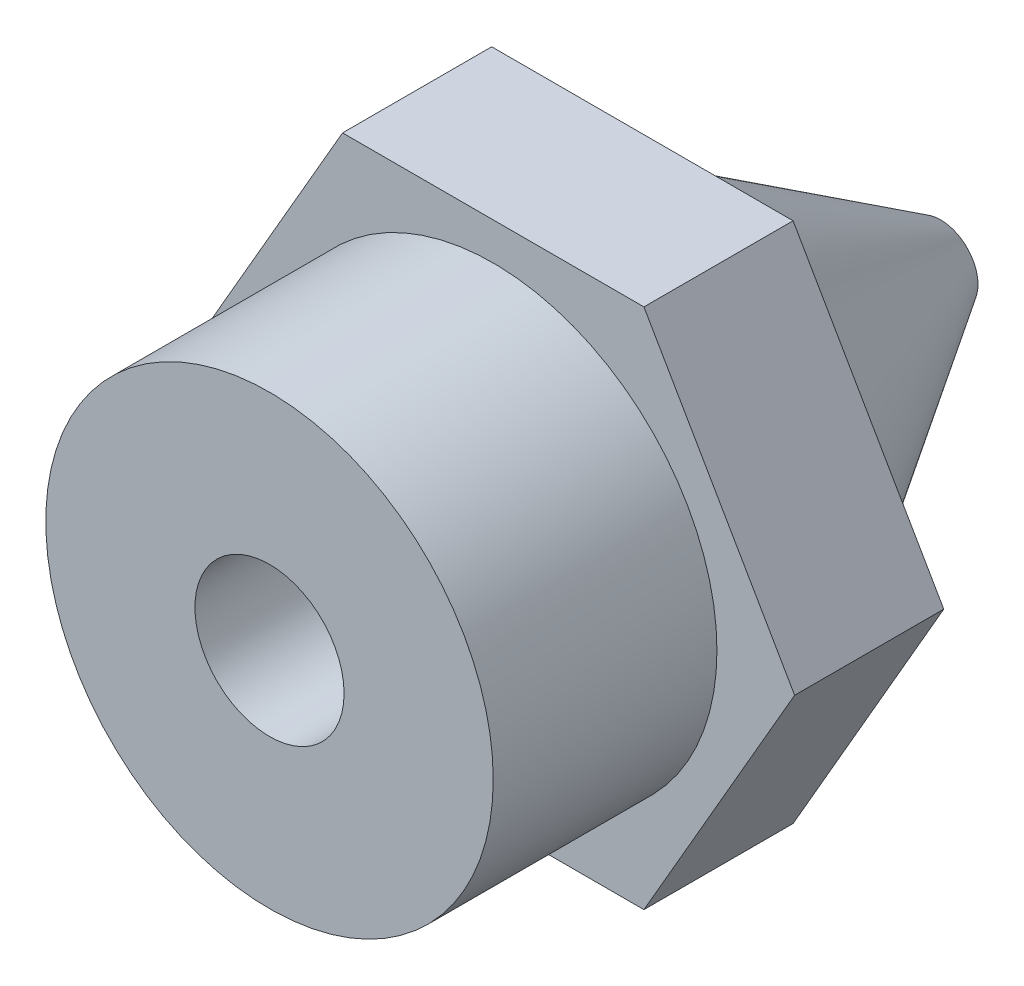
ISO-10303-21;
HEADER;
FILE_DESCRIPTION(('STEP AP214'),'2;1');
FILE_NAME('part.step','',(''),(''),'','','');
FILE_SCHEMA(('AUTOMOTIVE_DESIGN { 1 0 10303 214 1 1 1 1 }'));
ENDSEC;
DATA;
#1=APPLICATION_CONTEXT('core data for automotive mechanical design processes');
#2=APPLICATION_PROTOCOL_DEFINITION('international standard','automotive_design',2000,#1);
#3=PRODUCT_CONTEXT('',#1,'mechanical');
#4=PRODUCT('Part','Part','',(#3));
#5=PRODUCT_RELATED_PRODUCT_CATEGORY('part','',(#4));
#6=PRODUCT_DEFINITION_FORMATION('','',#4);
#7=PRODUCT_DEFINITION_CONTEXT('part definition',#1,'design');
#8=PRODUCT_DEFINITION('design','',#6,#7);
#9=PRODUCT_DEFINITION_SHAPE('','',#8);
#10=(LENGTH_UNIT() NAMED_UNIT(*) SI_UNIT(.MILLI.,.METRE.));
#11=(NAMED_UNIT(*) PLANE_ANGLE_UNIT() SI_UNIT($,.RADIAN.));
#12=(NAMED_UNIT(*) SI_UNIT($,.STERADIAN.) SOLID_ANGLE_UNIT());
#13=UNCERTAINTY_MEASURE_WITH_UNIT(LENGTH_MEASURE(1.E-05),#10,'distance_accuracy_value','');
#14=(GEOMETRIC_REPRESENTATION_CONTEXT(3) GLOBAL_UNCERTAINTY_ASSIGNED_CONTEXT((#13)) GLOBAL_UNIT_ASSIGNED_CONTEXT((#10,
#11,#12)) REPRESENTATION_CONTEXT('',''));
#15=CARTESIAN_POINT('',(0.,0.,0.));
#16=DIRECTION('',(0.,0.,1.));
#17=DIRECTION('',(1.,0.,0.));
#18=AXIS2_PLACEMENT_3D('',#15,#16,#17);
#19=CARTESIAN_POINT('',(2.02072594216368,3.50000000000001,9.));
#20=DIRECTION('',(0.,-1.,0.));
#21=DIRECTION('',(1.,0.,0.));
#22=AXIS2_PLACEMENT_3D('',#19,#20,#21);
#23=PLANE('',#22);
#24=DIRECTION('',(1.,0.,0.));
#25=VECTOR('',#24,1.);
#26=CARTESIAN_POINT('',(2.02072594216368,3.50000000000001,4.));
#27=LINE('',#26,#25);
#28=CARTESIAN_POINT('',(-2.02072594216371,3.49999999999999,4.));
#29=VERTEX_POINT('',#28);
#30=CARTESIAN_POINT('',(2.02072594216368,3.50000000000001,4.));
#31=VERTEX_POINT('',#30);
#32=EDGE_CURVE('E61',#29,#31,#27,.T.);
#33=ORIENTED_EDGE('',*,*,#32,.F.);
#34=DIRECTION('',(0.,0.,-1.));
#35=VECTOR('',#34,1.);
#36=CARTESIAN_POINT('',(-2.02072594216371,3.49999999999999,9.));
#37=LINE('',#36,#35);
#38=CARTESIAN_POINT('',(-2.02072594216371,3.49999999999999,6.));
#39=VERTEX_POINT('',#38);
#40=EDGE_CURVE('E129',#39,#29,#37,.T.);
#41=ORIENTED_EDGE('',*,*,#40,.F.);
#42=DIRECTION('',(-1.,0.,0.));
#43=VECTOR('',#42,1.);
#44=CARTESIAN_POINT('',(2.02072594216368,3.50000000000001,6.));
#45=LINE('',#44,#43);
#46=CARTESIAN_POINT('',(2.02072594216368,3.50000000000001,6.));
#47=VERTEX_POINT('',#46);
#48=EDGE_CURVE('E120',#47,#39,#45,.T.);
#49=ORIENTED_EDGE('',*,*,#48,.F.);
#50=DIRECTION('',(0.,0.,-1.));
#51=VECTOR('',#50,1.);
#52=CARTESIAN_POINT('',(2.02072594216368,3.50000000000001,9.));
#53=LINE('',#52,#51);
#54=EDGE_CURVE('E116',#47,#31,#53,.T.);
#55=ORIENTED_EDGE('',*,*,#54,.T.);
#56=EDGE_LOOP('',(#33,#41,#49,#55));
#57=FACE_BOUND('',#56,.T.);
#58=ADVANCED_FACE('F46',(#57),#23,.F.);
#59=CARTESIAN_POINT('',(-2.02072594216371,3.49999999999999,9.));
#60=DIRECTION('',(0.866025403784441,-0.499999999999995,0.));
#61=DIRECTION('',(0.499999999999995,0.866025403784442,0.));
#62=AXIS2_PLACEMENT_3D('',#59,#60,#61);
#63=PLANE('',#62);
#64=DIRECTION('',(0.499999999999995,0.866025403784442,0.));
#65=VECTOR('',#64,1.);
#66=CARTESIAN_POINT('',(-2.02072594216371,3.49999999999999,4.));
#67=LINE('',#66,#65);
#68=CARTESIAN_POINT('',(-4.04145188432738,0.,4.));
#69=VERTEX_POINT('',#68);
#70=EDGE_CURVE('E152',#69,#29,#67,.T.);
#71=ORIENTED_EDGE('',*,*,#70,.F.);
#72=DIRECTION('',(0.,0.,-1.));
#73=VECTOR('',#72,1.);
#74=CARTESIAN_POINT('',(-4.04145188432738,0.,9.));
#75=LINE('',#74,#73);
#76=CARTESIAN_POINT('',(-4.04145188432738,0.,6.));
#77=VERTEX_POINT('',#76);
#78=EDGE_CURVE('E126',#77,#69,#75,.T.);
#79=ORIENTED_EDGE('',*,*,#78,.F.);
#80=DIRECTION('',(-0.499999999999995,-0.866025403784442,0.));
#81=VECTOR('',#80,1.);
#82=CARTESIAN_POINT('',(-2.02072594216371,3.49999999999999,6.));
#83=LINE('',#82,#81);
#84=EDGE_CURVE('E137',#39,#77,#83,.T.);
#85=ORIENTED_EDGE('',*,*,#84,.F.);
#86=ORIENTED_EDGE('',*,*,#40,.T.);
#87=EDGE_LOOP('',(#71,#79,#85,#86));
#88=FACE_BOUND('',#87,.T.);
#89=ADVANCED_FACE('F192',(#88),#63,.F.);
#90=CARTESIAN_POINT('',(-4.04145188432738,0.,9.));
#91=DIRECTION('',(0.866025403784434,0.500000000000007,0.));
#92=DIRECTION('',(-0.500000000000007,0.866025403784435,0.));
#93=AXIS2_PLACEMENT_3D('',#90,#91,#92);
#94=PLANE('',#93);
#95=DIRECTION('',(-0.500000000000007,0.866025403784435,0.));
#96=VECTOR('',#95,1.);
#97=CARTESIAN_POINT('',(-4.04145188432738,0.,4.));
#98=LINE('',#97,#96);
#99=CARTESIAN_POINT('',(-2.02072594216366,-3.50000000000002,4.));
#100=VERTEX_POINT('',#99);
#101=EDGE_CURVE('E154',#100,#69,#98,.T.);
#102=ORIENTED_EDGE('',*,*,#101,.F.);
#103=DIRECTION('',(0.,0.,-1.));
#104=VECTOR('',#103,1.);
#105=CARTESIAN_POINT('',(-2.02072594216366,-3.50000000000002,9.));
#106=LINE('',#105,#104);
#107=CARTESIAN_POINT('',(-2.02072594216366,-3.50000000000002,6.));
#108=VERTEX_POINT('',#107);
#109=EDGE_CURVE('E118',#108,#100,#106,.T.);
#110=ORIENTED_EDGE('',*,*,#109,.F.);
#111=DIRECTION('',(0.500000000000007,-0.866025403784435,0.));
#112=VECTOR('',#111,1.);
#113=CARTESIAN_POINT('',(-4.04145188432738,0.,6.));
#114=LINE('',#113,#112);
#115=EDGE_CURVE('E138',#77,#108,#114,.T.);
#116=ORIENTED_EDGE('',*,*,#115,.F.);
#117=ORIENTED_EDGE('',*,*,#78,.T.);
#118=EDGE_LOOP('',(#102,#110,#116,#117));
#119=FACE_BOUND('',#118,.T.);
#120=ADVANCED_FACE('F196',(#119),#94,.F.);
#121=CARTESIAN_POINT('',(-2.02072594216366,-3.50000000000002,9.));
#122=DIRECTION('',(0.,1.,0.));
#123=DIRECTION('',(-1.,0.,0.));
#124=AXIS2_PLACEMENT_3D('',#121,#122,#123);
#125=PLANE('',#124);
#126=DIRECTION('',(-1.,0.,0.));
#127=VECTOR('',#126,1.);
#128=CARTESIAN_POINT('',(-2.02072594216366,-3.50000000000002,4.));
#129=LINE('',#128,#127);
#130=CARTESIAN_POINT('',(2.02072594216373,-3.49999999999998,4.));
#131=VERTEX_POINT('',#130);
#132=EDGE_CURVE('E112',#131,#100,#129,.T.);
#133=ORIENTED_EDGE('',*,*,#132,.F.);
#134=DIRECTION('',(0.,0.,-1.));
#135=VECTOR('',#134,1.);
#136=CARTESIAN_POINT('',(2.02072594216373,-3.49999999999998,9.));
#137=LINE('',#136,#135);
#138=CARTESIAN_POINT('',(2.02072594216373,-3.49999999999998,6.));
#139=VERTEX_POINT('',#138);
#140=EDGE_CURVE('E111',#139,#131,#137,.T.);
#141=ORIENTED_EDGE('',*,*,#140,.F.);
#142=DIRECTION('',(1.,0.,0.));
#143=VECTOR('',#142,1.);
#144=CARTESIAN_POINT('',(-2.02072594216366,-3.50000000000002,6.));
#145=LINE('',#144,#143);
#146=EDGE_CURVE('E142',#108,#139,#145,.T.);
#147=ORIENTED_EDGE('',*,*,#146,.F.);
#148=ORIENTED_EDGE('',*,*,#109,.T.);
#149=EDGE_LOOP('',(#133,#141,#147,#148));
#150=FACE_BOUND('',#149,.T.);
#151=ADVANCED_FACE('F202',(#150),#125,.F.);
#152=CARTESIAN_POINT('',(2.02072594216373,-3.49999999999998,9.));
#153=DIRECTION('',(-0.866025403784442,0.499999999999995,0.));
#154=DIRECTION('',(-0.499999999999995,-0.866025403784442,0.));
#155=AXIS2_PLACEMENT_3D('',#152,#153,#154);
#156=PLANE('',#155);
#157=DIRECTION('',(-0.499999999999995,-0.866025403784442,0.));
#158=VECTOR('',#157,1.);
#159=CARTESIAN_POINT('',(2.02072594216373,-3.49999999999998,4.));
#160=LINE('',#159,#158);
#161=CARTESIAN_POINT('',(4.04145188432738,0.,4.));
#162=VERTEX_POINT('',#161);
#163=EDGE_CURVE('E98',#162,#131,#160,.T.);
#164=ORIENTED_EDGE('',*,*,#163,.F.);
#165=DIRECTION('',(0.,0.,-1.));
#166=VECTOR('',#165,1.);
#167=CARTESIAN_POINT('',(4.04145188432738,0.,9.));
#168=LINE('',#167,#166);
#169=CARTESIAN_POINT('',(4.04145188432738,0.,6.));
#170=VERTEX_POINT('',#169);
#171=EDGE_CURVE('E109',#170,#162,#168,.T.);
#172=ORIENTED_EDGE('',*,*,#171,.F.);
#173=DIRECTION('',(0.499999999999995,0.866025403784442,0.));
#174=VECTOR('',#173,1.);
#175=CARTESIAN_POINT('',(2.02072594216373,-3.49999999999998,6.));
#176=LINE('',#175,#174);
#177=EDGE_CURVE('E69',#139,#170,#176,.T.);
#178=ORIENTED_EDGE('',*,*,#177,.F.);
#179=ORIENTED_EDGE('',*,*,#140,.T.);
#180=EDGE_LOOP('',(#164,#172,#178,#179));
#181=FACE_BOUND('',#180,.T.);
#182=ADVANCED_FACE('F108',(#181),#156,.F.);
#183=CARTESIAN_POINT('',(4.04145188432738,0.,9.));
#184=DIRECTION('',(-0.866025403784438,-0.500000000000001,0.));
#185=DIRECTION('',(0.500000000000001,-0.866025403784438,0.));
#186=AXIS2_PLACEMENT_3D('',#183,#184,#185);
#187=PLANE('',#186);
#188=DIRECTION('',(0.500000000000001,-0.866025403784438,0.));
#189=VECTOR('',#188,1.);
#190=CARTESIAN_POINT('',(4.04145188432738,0.,4.));
#191=LINE('',#190,#189);
#192=EDGE_CURVE('E54',#31,#162,#191,.T.);
#193=ORIENTED_EDGE('',*,*,#192,.F.);
#194=ORIENTED_EDGE('',*,*,#54,.F.);
#195=DIRECTION('',(-0.500000000000001,0.866025403784438,0.));
#196=VECTOR('',#195,1.);
#197=CARTESIAN_POINT('',(4.04145188432738,0.,6.));
#198=LINE('',#197,#196);
#199=EDGE_CURVE('E104',#170,#47,#198,.T.);
#200=ORIENTED_EDGE('',*,*,#199,.F.);
#201=ORIENTED_EDGE('',*,*,#171,.T.);
#202=EDGE_LOOP('',(#193,#194,#200,#201));
#203=FACE_BOUND('',#202,.T.);
#204=ADVANCED_FACE('F115',(#203),#187,.F.);
#205=CARTESIAN_POINT('',(0.,0.,6.));
#206=DIRECTION('',(0.,0.,1.));
#207=DIRECTION('',(1.,0.,0.));
#208=AXIS2_PLACEMENT_3D('',#205,#206,#207);
#209=PLANE('',#208);
#210=CARTESIAN_POINT('',(0.,0.,6.));
#211=DIRECTION('',(0.,0.,1.));
#212=DIRECTION('',(1.,0.,0.));
#213=AXIS2_PLACEMENT_3D('',#210,#211,#212);
#214=CIRCLE('',#213,3.);
#215=CARTESIAN_POINT('',(3.,0.,6.));
#216=VERTEX_POINT('',#215);
#217=EDGE_CURVE('E145',#216,#216,#214,.T.);
#218=ORIENTED_EDGE('',*,*,#217,.F.);
#219=EDGE_LOOP('',(#218));
#220=FACE_BOUND('',#219,.T.);
#221=ORIENTED_EDGE('',*,*,#48,.T.);
#222=ORIENTED_EDGE('',*,*,#84,.T.);
#223=ORIENTED_EDGE('',*,*,#115,.T.);
#224=ORIENTED_EDGE('',*,*,#146,.T.);
#225=ORIENTED_EDGE('',*,*,#177,.T.);
#226=ORIENTED_EDGE('',*,*,#199,.T.);
#227=EDGE_LOOP('',(#221,#222,#223,#224,#225,#226));
#228=FACE_BOUND('',#227,.T.);
#229=ADVANCED_FACE('F133',(#220,#228),#209,.T.);
#230=CARTESIAN_POINT('',(0.,0.,6.));
#231=DIRECTION('',(0.,0.,1.));
#232=DIRECTION('',(1.,0.,0.));
#233=AXIS2_PLACEMENT_3D('',#230,#231,#232);
#234=CYLINDRICAL_SURFACE('',#233,3.);
#235=ORIENTED_EDGE('',*,*,#217,.T.);
#236=EDGE_LOOP('',(#235));
#237=FACE_BOUND('',#236,.T.);
#238=CARTESIAN_POINT('',(0.,0.,9.));
#239=DIRECTION('',(0.,0.,1.));
#240=DIRECTION('',(1.,0.,0.));
#241=AXIS2_PLACEMENT_3D('',#238,#239,#240);
#242=CIRCLE('',#241,3.);
#243=CARTESIAN_POINT('',(3.,0.,9.));
#244=VERTEX_POINT('',#243);
#245=EDGE_CURVE('E146',#244,#244,#242,.T.);
#246=ORIENTED_EDGE('',*,*,#245,.F.);
#247=EDGE_LOOP('',(#246));
#248=FACE_BOUND('',#247,.T.);
#249=ADVANCED_FACE('F177',(#237,#248),#234,.T.);
#250=CARTESIAN_POINT('',(0.,0.,9.));
#251=DIRECTION('',(0.,0.,1.));
#252=DIRECTION('',(1.,0.,0.));
#253=AXIS2_PLACEMENT_3D('',#250,#251,#252);
#254=PLANE('',#253);
#255=CARTESIAN_POINT('',(0.,0.,9.));
#256=DIRECTION('',(0.,0.,1.));
#257=DIRECTION('',(1.,0.,0.));
#258=AXIS2_PLACEMENT_3D('',#255,#256,#257);
#259=CIRCLE('',#258,1.);
#260=CARTESIAN_POINT('',(1.,0.,9.));
#261=VERTEX_POINT('',#260);
#262=EDGE_CURVE('E168',#261,#261,#259,.T.);
#263=ORIENTED_EDGE('',*,*,#262,.F.);
#264=EDGE_LOOP('',(#263));
#265=FACE_BOUND('',#264,.T.);
#266=ORIENTED_EDGE('',*,*,#245,.T.);
#267=EDGE_LOOP('',(#266));
#268=FACE_BOUND('',#267,.T.);
#269=ADVANCED_FACE('F174',(#265,#268),#254,.T.);
#270=CARTESIAN_POINT('',(0.,0.,4.));
#271=DIRECTION('',(0.,0.,-1.));
#272=DIRECTION('',(-1.,0.,0.));
#273=AXIS2_PLACEMENT_3D('',#270,#271,#272);
#274=PLANE('',#273);
#275=CARTESIAN_POINT('',(0.,0.,4.));
#276=DIRECTION('',(0.,0.,-1.));
#277=DIRECTION('',(-1.,0.,0.));
#278=AXIS2_PLACEMENT_3D('',#275,#276,#277);
#279=CIRCLE('',#278,3.);
#280=CARTESIAN_POINT('',(2.99999999999998,0.,4.));
#281=VERTEX_POINT('',#280);
#282=EDGE_CURVE('E113',#281,#281,#279,.T.);
#283=ORIENTED_EDGE('',*,*,#282,.F.);
#284=EDGE_LOOP('',(#283));
#285=FACE_BOUND('',#284,.T.);
#286=ORIENTED_EDGE('',*,*,#32,.T.);
#287=ORIENTED_EDGE('',*,*,#192,.T.);
#288=ORIENTED_EDGE('',*,*,#163,.T.);
#289=ORIENTED_EDGE('',*,*,#132,.T.);
#290=ORIENTED_EDGE('',*,*,#101,.T.);
#291=ORIENTED_EDGE('',*,*,#70,.T.);
#292=EDGE_LOOP('',(#286,#287,#288,#289,#290,#291));
#293=FACE_BOUND('',#292,.T.);
#294=ADVANCED_FACE('F97',(#285,#293),#274,.T.);
#295=CARTESIAN_POINT('',(0.,0.,0.));
#296=DIRECTION('',(0.,0.,1.));
#297=DIRECTION('',(1.,0.,0.));
#298=AXIS2_PLACEMENT_3D('',#295,#296,#297);
#299=PLANE('',#298);
#300=CARTESIAN_POINT('',(0.,0.,0.));
#301=DIRECTION('',(0.,0.,1.));
#302=DIRECTION('',(1.,0.,0.));
#303=AXIS2_PLACEMENT_3D('',#300,#301,#302);
#304=CIRCLE('',#303,0.2);
#305=CARTESIAN_POINT('',(0.2,0.,0.));
#306=VERTEX_POINT('',#305);
#307=EDGE_CURVE('E159',#306,#306,#304,.T.);
#308=ORIENTED_EDGE('',*,*,#307,.T.);
#309=EDGE_LOOP('',(#308));
#310=FACE_BOUND('',#309,.T.);
#311=CARTESIAN_POINT('',(0.,0.,0.));
#312=DIRECTION('',(0.,0.,1.));
#313=DIRECTION('',(1.,0.,0.));
#314=AXIS2_PLACEMENT_3D('',#311,#312,#313);
#315=CIRCLE('',#314,0.500522592362688);
#316=CARTESIAN_POINT('',(0.500522592362688,0.,0.));
#317=VERTEX_POINT('',#316);
#318=EDGE_CURVE('E13',#317,#317,#315,.F.);
#319=ORIENTED_EDGE('',*,*,#318,.T.);
#320=EDGE_LOOP('',(#319));
#321=FACE_BOUND('',#320,.T.);
#322=ADVANCED_FACE('F211',(#310,#321),#299,.F.);
#323=CARTESIAN_POINT('',(0.,0.,0.));
#324=DIRECTION('',(0.,0.,1.));
#325=DIRECTION('',(1.,0.,0.));
#326=AXIS2_PLACEMENT_3D('',#323,#324,#325);
#327=CONICAL_SURFACE('',#326,0.500522592362688,0.558505360638183);
#328=CARTESIAN_POINT('',(2.99999999999998,0.,4.));
#329=CARTESIAN_POINT('',(2.97396377700376,0.,3.95833333333333));
#330=CARTESIAN_POINT('',(2.94792755400754,0.,3.91666666666667));
#331=CARTESIAN_POINT('',(2.8958551080151,0.,3.83333333333333));
#332=CARTESIAN_POINT('',(2.86981888501887,0.,3.79166666666667));
#333=CARTESIAN_POINT('',(2.81774643902643,0.,3.70833333333333));
#334=CARTESIAN_POINT('',(2.79171021603021,0.,3.66666666666667));
#335=CARTESIAN_POINT('',(2.73963777003777,0.,3.58333333333333));
#336=CARTESIAN_POINT('',(2.71360154704154,0.,3.54166666666667));
#337=CARTESIAN_POINT('',(2.6615291010491,0.,3.45833333333333));
#338=CARTESIAN_POINT('',(2.63549287805288,0.,3.41666666666667));
#339=CARTESIAN_POINT('',(2.58342043206043,0.,3.33333333333333));
#340=CARTESIAN_POINT('',(2.55738420906421,0.,3.29166666666667));
#341=CARTESIAN_POINT('',(2.50531176307177,0.,3.20833333333333));
#342=CARTESIAN_POINT('',(2.47927554007555,0.,3.16666666666667));
#343=CARTESIAN_POINT('',(2.4272030940831,0.,3.08333333333333));
#344=CARTESIAN_POINT('',(2.40116687108688,0.,3.04166666666667));
#345=CARTESIAN_POINT('',(2.34909442509444,0.,2.95833333333333));
#346=CARTESIAN_POINT('',(2.32305820209822,0.,2.91666666666667));
#347=CARTESIAN_POINT('',(2.27098575610577,0.,2.83333333333333));
#348=CARTESIAN_POINT('',(2.24494953310955,0.,2.79166666666667));
#349=CARTESIAN_POINT('',(2.19287708711711,0.,2.70833333333333));
#350=CARTESIAN_POINT('',(2.16684086412088,0.,2.66666666666667));
#351=CARTESIAN_POINT('',(2.11476841812844,0.,2.58333333333333));
#352=CARTESIAN_POINT('',(2.08873219513222,0.,2.54166666666667));
#353=CARTESIAN_POINT('',(2.03665974913978,0.,2.45833333333333));
#354=CARTESIAN_POINT('',(2.01062352614355,0.,2.41666666666667));
#355=CARTESIAN_POINT('',(1.95855108015111,0.,2.33333333333333));
#356=CARTESIAN_POINT('',(1.93251485715489,0.,2.29166666666667));
#357=CARTESIAN_POINT('',(1.88044241116245,0.,2.20833333333333));
#358=CARTESIAN_POINT('',(1.85440618816622,0.,2.16666666666667));
#359=CARTESIAN_POINT('',(1.80233374217378,0.,2.08333333333333));
#360=CARTESIAN_POINT('',(1.77629751917756,0.,2.04166666666667));
#361=CARTESIAN_POINT('',(1.72422507318511,0.,1.95833333333333));
#362=CARTESIAN_POINT('',(1.69818885018889,0.,1.91666666666667));
#363=CARTESIAN_POINT('',(1.64611640419645,0.,1.83333333333333));
#364=CARTESIAN_POINT('',(1.62008018120023,0.,1.79166666666667));
#365=CARTESIAN_POINT('',(1.56800773520778,0.,1.70833333333333));
#366=CARTESIAN_POINT('',(1.54197151221156,0.,1.66666666666667));
#367=CARTESIAN_POINT('',(1.48989906621912,0.,1.58333333333333));
#368=CARTESIAN_POINT('',(1.4638628432229,0.,1.54166666666667));
#369=CARTESIAN_POINT('',(1.41179039723045,0.,1.45833333333333));
#370=CARTESIAN_POINT('',(1.38575417423423,0.,1.41666666666667));
#371=CARTESIAN_POINT('',(1.33368172824179,0.,1.33333333333333));
#372=CARTESIAN_POINT('',(1.30764550524556,0.,1.29166666666667));
#373=CARTESIAN_POINT('',(1.25557305925312,0.,1.20833333333333));
#374=CARTESIAN_POINT('',(1.2295368362569,0.,1.16666666666667));
#375=CARTESIAN_POINT('',(1.17746439026446,0.,1.08333333333333));
#376=CARTESIAN_POINT('',(1.15142816726823,0.,1.04166666666667));
#377=CARTESIAN_POINT('',(1.09935572127579,0.,0.958333333333333));
#378=CARTESIAN_POINT('',(1.07331949827957,0.,0.916666666666667));
#379=CARTESIAN_POINT('',(1.02124705228712,0.,0.833333333333333));
#380=CARTESIAN_POINT('',(0.995210829290903,0.,0.791666666666667));
#381=CARTESIAN_POINT('',(0.943138383298459,0.,0.708333333333333));
#382=CARTESIAN_POINT('',(0.917102160302237,0.,0.666666666666667));
#383=CARTESIAN_POINT('',(0.865029714309794,0.,0.583333333333333));
#384=CARTESIAN_POINT('',(0.838993491313572,0.,0.541666666666667));
#385=CARTESIAN_POINT('',(0.786921045321128,0.,0.458333333333333));
#386=CARTESIAN_POINT('',(0.760884822324907,0.,0.416666666666667));
#387=CARTESIAN_POINT('',(0.708812376332463,0.,0.333333333333333));
#388=CARTESIAN_POINT('',(0.682776153336241,0.,0.291666666666667));
#389=CARTESIAN_POINT('',(0.630703707343798,0.,0.208333333333333));
#390=CARTESIAN_POINT('',(0.604667484347576,0.,0.166666666666667));
#391=CARTESIAN_POINT('',(0.552595038355132,0.,0.0833333333333335));
#392=CARTESIAN_POINT('',(0.52655881535891,0.,0.0416666666666668));
#393=CARTESIAN_POINT('',(0.500522592362688,0.,0.));
#394=B_SPLINE_CURVE_WITH_KNOTS('',3,(#328,#329,#330,#331,#332,#333,#334,#335,#336,#337,#338,
#339,#340,#341,#342,#343,#344,#345,#346,#347,#348,#349,#350,#351,#352,#353,#354,#355,#356,#357,
#358,#359,#360,#361,#362,#363,#364,#365,#366,#367,#368,#369,#370,#371,#372,#373,#374,#375,#376,
#377,#378,#379,#380,#381,#382,#383,#384,#385,#386,#387,#388,#389,#390,#391,#392,#393),
.UNSPECIFIED.,.F.,.F.,(4,2,2,2,2,2,2,2,2,2,2,2,2,2,2,2,2,2,2,2,2,2,2,2,2,2,2,2,2,2,2,2,4),(0.,
0.147397300420262,0.294794600840524,0.442191901260785,0.589589201681047,0.736986502101309,
0.884383802521571,1.03178110294183,1.17917840336209,1.32657570378236,1.47397300420262,
1.62137030462288,1.76876760504314,1.9161649054634,2.06356220588366,2.21095950630393,
2.35835680672419,2.50575410714445,2.65315140756471,2.80054870798497,2.94794600840524,
3.0953433088255,3.24274060924576,3.39013790966602,3.53753521008628,3.68493251050655,
3.83232981092681,3.97972711134707,4.12712441176733,4.27452171218759,4.42191901260786,
4.56931631302812,4.71671361344838),.UNSPECIFIED.);
#395=EDGE_CURVE('BSEAM48',#281,#317,#394,.T.);
#396=ORIENTED_EDGE('',*,*,#282,.T.);
#397=ORIENTED_EDGE('',*,*,#318,.F.);
#398=ORIENTED_EDGE('',*,*,#395,.T.);
#399=ORIENTED_EDGE('',*,*,#395,.F.);
#400=EDGE_LOOP('',(#396,#398,#397,#399));
#401=FACE_BOUND('',#400,.T.);
#402=ADVANCED_FACE('F48',(#401),#327,.T.);
#403=CARTESIAN_POINT('',(0.,0.,9.40460335077427));
#404=DIRECTION('',(0.,0.,1.));
#405=DIRECTION('',(1.,0.,0.));
#406=AXIS2_PLACEMENT_3D('',#403,#404,#405);
#407=CYLINDRICAL_SURFACE('',#406,0.2);
#408=ORIENTED_EDGE('',*,*,#307,.F.);
#409=EDGE_LOOP('',(#408));
#410=FACE_BOUND('',#409,.T.);
#411=CARTESIAN_POINT('',(0.,0.,0.5));
#412=DIRECTION('',(0.,0.,1.));
#413=DIRECTION('',(1.,0.,0.));
#414=AXIS2_PLACEMENT_3D('',#411,#412,#413);
#415=CIRCLE('',#414,0.2);
#416=CARTESIAN_POINT('',(0.2,0.,0.5));
#417=VERTEX_POINT('',#416);
#418=EDGE_CURVE('E162',#417,#417,#415,.T.);
#419=ORIENTED_EDGE('',*,*,#418,.T.);
#420=EDGE_LOOP('',(#419));
#421=FACE_BOUND('',#420,.T.);
#422=ADVANCED_FACE('F218',(#410,#421),#407,.F.);
#423=CARTESIAN_POINT('',(0.,0.,1.6425184053937));
#424=DIRECTION('',(0.,0.,1.));
#425=DIRECTION('',(1.,0.,0.));
#426=AXIS2_PLACEMENT_3D('',#423,#424,#425);
#427=CONICAL_SURFACE('',#426,1.,0.610865238198013);
#428=CARTESIAN_POINT('',(0.,0.,1.6425184053937));
#429=DIRECTION('',(0.,0.,1.));
#430=DIRECTION('',(1.,0.,0.));
#431=AXIS2_PLACEMENT_3D('',#428,#429,#430);
#432=CIRCLE('',#431,1.);
#433=CARTESIAN_POINT('',(1.,0.,1.6425184053937));
#434=VERTEX_POINT('',#433);
#435=EDGE_CURVE('E165',#434,#434,#432,.T.);
#436=CARTESIAN_POINT('',(0.2,0.,0.5));
#437=CARTESIAN_POINT('',(0.208333333333334,0.,0.511901233389518));
#438=CARTESIAN_POINT('',(0.216666666666667,0.,0.523802466779036));
#439=CARTESIAN_POINT('',(0.233333333333334,0.,0.547604933558071));
#440=CARTESIAN_POINT('',(0.241666666666667,0.,0.559506166947589));
#441=CARTESIAN_POINT('',(0.258333333333333,0.,0.583308633726624));
#442=CARTESIAN_POINT('',(0.266666666666667,0.,0.595209867116142));
#443=CARTESIAN_POINT('',(0.283333333333333,0.,0.619012333895177));
#444=CARTESIAN_POINT('',(0.291666666666667,0.,0.630913567284695));
#445=CARTESIAN_POINT('',(0.308333333333334,0.,0.65471603406373));
#446=CARTESIAN_POINT('',(0.316666666666667,0.,0.666617267453248));
#447=CARTESIAN_POINT('',(0.333333333333333,0.,0.690419734232283));
#448=CARTESIAN_POINT('',(0.341666666666667,0.,0.702320967621801));
#449=CARTESIAN_POINT('',(0.358333333333334,0.,0.726123434400836));
#450=CARTESIAN_POINT('',(0.366666666666667,0.,0.738024667790354));
#451=CARTESIAN_POINT('',(0.383333333333333,0.,0.761827134569389));
#452=CARTESIAN_POINT('',(0.391666666666667,0.,0.773728367958907));
#453=CARTESIAN_POINT('',(0.408333333333333,0.,0.797530834737942));
#454=CARTESIAN_POINT('',(0.416666666666667,0.,0.80943206812746));
#455=CARTESIAN_POINT('',(0.433333333333333,0.,0.833234534906495));
#456=CARTESIAN_POINT('',(0.441666666666667,0.,0.845135768296013));
#457=CARTESIAN_POINT('',(0.458333333333333,0.,0.868938235075048));
#458=CARTESIAN_POINT('',(0.466666666666667,0.,0.880839468464566));
#459=CARTESIAN_POINT('',(0.483333333333334,0.,0.904641935243601));
#460=CARTESIAN_POINT('',(0.491666666666667,0.,0.916543168633119));
#461=CARTESIAN_POINT('',(0.508333333333334,0.,0.940345635412154));
#462=CARTESIAN_POINT('',(0.516666666666667,0.,0.952246868801672));
#463=CARTESIAN_POINT('',(0.533333333333334,0.,0.976049335580707));
#464=CARTESIAN_POINT('',(0.541666666666667,0.,0.987950568970225));
#465=CARTESIAN_POINT('',(0.558333333333333,0.,1.01175303574926));
#466=CARTESIAN_POINT('',(0.566666666666667,0.,1.02365426913878));
#467=CARTESIAN_POINT('',(0.583333333333333,0.,1.04745673591781));
#468=CARTESIAN_POINT('',(0.591666666666667,0.,1.05935796930733));
#469=CARTESIAN_POINT('',(0.608333333333333,0.,1.08316043608637));
#470=CARTESIAN_POINT('',(0.616666666666667,0.,1.09506166947588));
#471=CARTESIAN_POINT('',(0.633333333333333,0.,1.11886413625492));
#472=CARTESIAN_POINT('',(0.641666666666667,0.,1.13076536964444));
#473=CARTESIAN_POINT('',(0.658333333333333,0.,1.15456783642347));
#474=CARTESIAN_POINT('',(0.666666666666667,0.,1.16646906981299));
#475=CARTESIAN_POINT('',(0.683333333333333,0.,1.19027153659203));
#476=CARTESIAN_POINT('',(0.691666666666667,0.,1.20217276998154));
#477=CARTESIAN_POINT('',(0.708333333333333,0.,1.22597523676058));
#478=CARTESIAN_POINT('',(0.716666666666667,0.,1.2378764701501));
#479=CARTESIAN_POINT('',(0.733333333333333,0.,1.26167893692913));
#480=CARTESIAN_POINT('',(0.741666666666667,0.,1.27358017031865));
#481=CARTESIAN_POINT('',(0.758333333333333,0.,1.29738263709768));
#482=CARTESIAN_POINT('',(0.766666666666667,0.,1.3092838704872));
#483=CARTESIAN_POINT('',(0.783333333333333,0.,1.33308633726624));
#484=CARTESIAN_POINT('',(0.791666666666667,0.,1.34498757065576));
#485=CARTESIAN_POINT('',(0.808333333333333,0.,1.36879003743479));
#486=CARTESIAN_POINT('',(0.816666666666667,0.,1.38069127082431));
#487=CARTESIAN_POINT('',(0.833333333333333,0.,1.40449373760334));
#488=CARTESIAN_POINT('',(0.841666666666667,0.,1.41639497099286));
#489=CARTESIAN_POINT('',(0.858333333333334,0.,1.4401974377719));
#490=CARTESIAN_POINT('',(0.866666666666667,0.,1.45209867116141));
#491=CARTESIAN_POINT('',(0.883333333333333,0.,1.47590113794045));
#492=CARTESIAN_POINT('',(0.891666666666667,0.,1.48780237132997));
#493=CARTESIAN_POINT('',(0.908333333333333,0.,1.511604838109));
#494=CARTESIAN_POINT('',(0.916666666666667,0.,1.52350607149852));
#495=CARTESIAN_POINT('',(0.933333333333333,0.,1.54730853827756));
#496=CARTESIAN_POINT('',(0.941666666666667,0.,1.55920977166707));
#497=CARTESIAN_POINT('',(0.958333333333333,0.,1.58301223844611));
#498=CARTESIAN_POINT('',(0.966666666666667,0.,1.59491347183563));
#499=CARTESIAN_POINT('',(0.983333333333333,0.,1.61871593861466));
#500=CARTESIAN_POINT('',(0.991666666666667,0.,1.63061717200418));
#501=CARTESIAN_POINT('',(1.,0.,1.6425184053937));
#502=B_SPLINE_CURVE_WITH_KNOTS('',3,(#436,#437,#438,#439,#440,#441,#442,#443,#444,#445,#446,
#447,#448,#449,#450,#451,#452,#453,#454,#455,#456,#457,#458,#459,#460,#461,#462,#463,#464,#465,
#466,#467,#468,#469,#470,#471,#472,#473,#474,#475,#476,#477,#478,#479,#480,#481,#482,#483,#484,
#485,#486,#487,#488,#489,#490,#491,#492,#493,#494,#495,#496,#497,#498,#499,#500,#501),
.UNSPECIFIED.,.F.,.F.,(4,2,2,2,2,2,2,2,2,2,2,2,2,2,2,2,2,2,2,2,2,2,2,2,2,2,2,2,2,2,2,2,4),(0.,
0.0435861698905277,0.0871723397810551,0.130758509671583,0.17434467956211,0.217930849452638,
0.261517019343165,0.305103189233693,0.348689359124221,0.392275529014748,0.435861698905276,
0.479447868795803,0.523034038686331,0.566620208576858,0.610206378467386,0.653792548357913,
0.697378718248441,0.740964888138969,0.784551058029496,0.828137227920024,0.871723397810551,
0.915309567701079,0.958895737591607,1.00248190748213,1.04606807737266,1.08965424726319,
1.13324041715372,1.17682658704424,1.22041275693477,1.2639989268253,1.30758509671583,
1.35117126660635,1.39475743649688),.UNSPECIFIED.);
#503=EDGE_CURVE('BSEAM229',#417,#434,#502,.T.);
#504=ORIENTED_EDGE('',*,*,#418,.F.);
#505=ORIENTED_EDGE('',*,*,#435,.T.);
#506=ORIENTED_EDGE('',*,*,#503,.T.);
#507=ORIENTED_EDGE('',*,*,#503,.F.);
#508=EDGE_LOOP('',(#504,#506,#505,#507));
#509=FACE_BOUND('',#508,.T.);
#510=ADVANCED_FACE('F229',(#509),#427,.F.);
#511=CARTESIAN_POINT('',(0.,0.,9.40460335077427));
#512=DIRECTION('',(0.,0.,1.));
#513=DIRECTION('',(1.,0.,0.));
#514=AXIS2_PLACEMENT_3D('',#511,#512,#513);
#515=CYLINDRICAL_SURFACE('',#514,1.);
#516=ORIENTED_EDGE('',*,*,#435,.F.);
#517=EDGE_LOOP('',(#516));
#518=FACE_BOUND('',#517,.T.);
#519=ORIENTED_EDGE('',*,*,#262,.T.);
#520=EDGE_LOOP('',(#519));
#521=FACE_BOUND('',#520,.T.);
#522=ADVANCED_FACE('F172',(#518,#521),#515,.F.);
#523=CLOSED_SHELL('',(#58,#89,#120,#151,#182,#204,#229,#249,#269,#294,#322,#402,#422,#510,#522));
#524=MANIFOLD_SOLID_BREP('B2',#523);
#525=ADVANCED_BREP_SHAPE_REPRESENTATION('',(#18,#524),#14);
#526=SHAPE_DEFINITION_REPRESENTATION(#9,#525);
ENDSEC;
END-ISO-10303-21;
